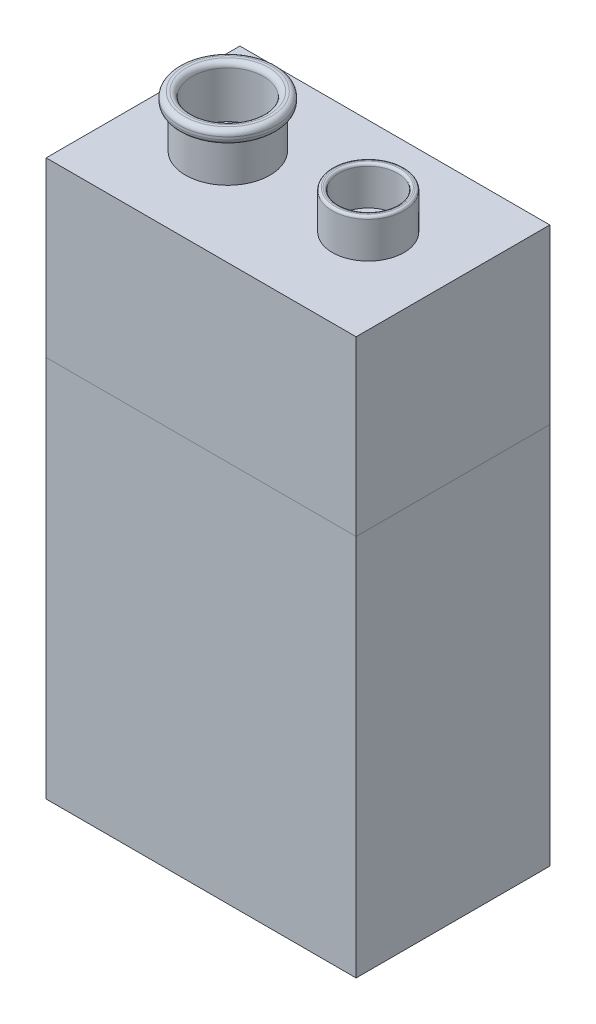
ISO-10303-21;
HEADER;
FILE_DESCRIPTION(('STEP AP214'),'2;1');
FILE_NAME('part.step','',(''),(''),'','','');
FILE_SCHEMA(('AUTOMOTIVE_DESIGN { 1 0 10303 214 1 1 1 1 }'));
ENDSEC;
DATA;
#1=APPLICATION_CONTEXT('core data for automotive mechanical design processes');
#2=APPLICATION_PROTOCOL_DEFINITION('international standard','automotive_design',2000,#1);
#3=PRODUCT_CONTEXT('',#1,'mechanical');
#4=PRODUCT('Part','Part','',(#3));
#5=PRODUCT_RELATED_PRODUCT_CATEGORY('part','',(#4));
#6=PRODUCT_DEFINITION_FORMATION('','',#4);
#7=PRODUCT_DEFINITION_CONTEXT('part definition',#1,'design');
#8=PRODUCT_DEFINITION('design','',#6,#7);
#9=PRODUCT_DEFINITION_SHAPE('','',#8);
#10=(LENGTH_UNIT() NAMED_UNIT(*) SI_UNIT(.MILLI.,.METRE.));
#11=(NAMED_UNIT(*) PLANE_ANGLE_UNIT() SI_UNIT($,.RADIAN.));
#12=(NAMED_UNIT(*) SI_UNIT($,.STERADIAN.) SOLID_ANGLE_UNIT());
#13=UNCERTAINTY_MEASURE_WITH_UNIT(LENGTH_MEASURE(1.E-05),#10,'distance_accuracy_value','');
#14=(GEOMETRIC_REPRESENTATION_CONTEXT(3) GLOBAL_UNCERTAINTY_ASSIGNED_CONTEXT((#13)) GLOBAL_UNIT_ASSIGNED_CONTEXT((#10,
#11,#12)) REPRESENTATION_CONTEXT('',''));
#15=CARTESIAN_POINT('',(0.,0.,0.));
#16=DIRECTION('',(0.,0.,1.));
#17=DIRECTION('',(1.,0.,0.));
#18=AXIS2_PLACEMENT_3D('',#15,#16,#17);
#19=CARTESIAN_POINT('',(0.,43.,0.));
#20=DIRECTION('',(1.,0.,0.));
#21=DIRECTION('',(0.,0.,-1.));
#22=AXIS2_PLACEMENT_3D('',#19,#20,#21);
#23=PLANE('',#22);
#24=DIRECTION('',(0.,0.,1.));
#25=VECTOR('',#24,1.);
#26=CARTESIAN_POINT('',(0.,29.6107821595239,0.));
#27=LINE('',#26,#25);
#28=CARTESIAN_POINT('',(0.,29.6107821595239,-15.));
#29=VERTEX_POINT('',#28);
#30=CARTESIAN_POINT('',(0.,29.6107821595239,0.));
#31=VERTEX_POINT('',#30);
#32=EDGE_CURVE('E11',#29,#31,#27,.T.);
#33=ORIENTED_EDGE('',*,*,#32,.F.);
#34=DIRECTION('',(0.,-1.,0.));
#35=VECTOR('',#34,1.);
#36=CARTESIAN_POINT('',(0.,43.,-15.));
#37=LINE('',#36,#35);
#38=CARTESIAN_POINT('',(0.,0.,-15.));
#39=VERTEX_POINT('',#38);
#40=EDGE_CURVE('E180',#29,#39,#37,.T.);
#41=ORIENTED_EDGE('',*,*,#40,.T.);
#42=DIRECTION('',(0.,0.,1.));
#43=VECTOR('',#42,1.);
#44=CARTESIAN_POINT('',(0.,0.,0.));
#45=LINE('',#44,#43);
#46=CARTESIAN_POINT('',(0.,0.,0.));
#47=VERTEX_POINT('',#46);
#48=EDGE_CURVE('E183',#39,#47,#45,.T.);
#49=ORIENTED_EDGE('',*,*,#48,.T.);
#50=DIRECTION('',(0.,-1.,0.));
#51=VECTOR('',#50,1.);
#52=CARTESIAN_POINT('',(0.,43.,0.));
#53=LINE('',#52,#51);
#54=EDGE_CURVE('E115',#31,#47,#53,.T.);
#55=ORIENTED_EDGE('',*,*,#54,.F.);
#56=EDGE_LOOP('',(#33,#41,#49,#55));
#57=FACE_BOUND('',#56,.T.);
#58=ADVANCED_FACE('F36',(#57),#23,.F.);
#59=CARTESIAN_POINT('',(0.,43.,-15.));
#60=DIRECTION('',(0.,0.,1.));
#61=DIRECTION('',(1.,0.,0.));
#62=AXIS2_PLACEMENT_3D('',#59,#60,#61);
#63=PLANE('',#62);
#64=DIRECTION('',(-1.,0.,0.));
#65=VECTOR('',#64,1.);
#66=CARTESIAN_POINT('',(0.,29.6107821595239,-15.));
#67=LINE('',#66,#65);
#68=CARTESIAN_POINT('',(24.,29.6107821595239,-15.));
#69=VERTEX_POINT('',#68);
#70=EDGE_CURVE('E46',#69,#29,#67,.T.);
#71=ORIENTED_EDGE('',*,*,#70,.F.);
#72=DIRECTION('',(0.,-1.,0.));
#73=VECTOR('',#72,1.);
#74=CARTESIAN_POINT('',(24.,43.,-15.));
#75=LINE('',#74,#73);
#76=CARTESIAN_POINT('',(24.,0.,-15.));
#77=VERTEX_POINT('',#76);
#78=EDGE_CURVE('E193',#69,#77,#75,.T.);
#79=ORIENTED_EDGE('',*,*,#78,.T.);
#80=DIRECTION('',(-1.,0.,0.));
#81=VECTOR('',#80,1.);
#82=CARTESIAN_POINT('',(0.,0.,-15.));
#83=LINE('',#82,#81);
#84=EDGE_CURVE('E110',#77,#39,#83,.T.);
#85=ORIENTED_EDGE('',*,*,#84,.T.);
#86=ORIENTED_EDGE('',*,*,#40,.F.);
#87=EDGE_LOOP('',(#71,#79,#85,#86));
#88=FACE_BOUND('',#87,.T.);
#89=ADVANCED_FACE('F195',(#88),#63,.F.);
#90=CARTESIAN_POINT('',(24.,43.,0.));
#91=DIRECTION('',(-1.,0.,0.));
#92=DIRECTION('',(0.,0.,1.));
#93=AXIS2_PLACEMENT_3D('',#90,#91,#92);
#94=PLANE('',#93);
#95=DIRECTION('',(0.,0.,-1.));
#96=VECTOR('',#95,1.);
#97=CARTESIAN_POINT('',(24.,29.6107821595239,0.));
#98=LINE('',#97,#96);
#99=CARTESIAN_POINT('',(24.,29.6107821595239,0.));
#100=VERTEX_POINT('',#99);
#101=EDGE_CURVE('E156',#100,#69,#98,.T.);
#102=ORIENTED_EDGE('',*,*,#101,.F.);
#103=DIRECTION('',(0.,-1.,0.));
#104=VECTOR('',#103,1.);
#105=CARTESIAN_POINT('',(24.,43.,0.));
#106=LINE('',#105,#104);
#107=CARTESIAN_POINT('',(24.,0.,0.));
#108=VERTEX_POINT('',#107);
#109=EDGE_CURVE('E169',#100,#108,#106,.T.);
#110=ORIENTED_EDGE('',*,*,#109,.T.);
#111=DIRECTION('',(0.,0.,-1.));
#112=VECTOR('',#111,1.);
#113=CARTESIAN_POINT('',(24.,0.,0.));
#114=LINE('',#113,#112);
#115=EDGE_CURVE('E188',#108,#77,#114,.T.);
#116=ORIENTED_EDGE('',*,*,#115,.T.);
#117=ORIENTED_EDGE('',*,*,#78,.F.);
#118=EDGE_LOOP('',(#102,#110,#116,#117));
#119=FACE_BOUND('',#118,.T.);
#120=ADVANCED_FACE('F198',(#119),#94,.F.);
#121=CARTESIAN_POINT('',(0.,43.,0.));
#122=DIRECTION('',(0.,0.,-1.));
#123=DIRECTION('',(-1.,0.,0.));
#124=AXIS2_PLACEMENT_3D('',#121,#122,#123);
#125=PLANE('',#124);
#126=DIRECTION('',(1.,0.,0.));
#127=VECTOR('',#126,1.);
#128=CARTESIAN_POINT('',(0.,29.6107821595239,0.));
#129=LINE('',#128,#127);
#130=EDGE_CURVE('E40',#31,#100,#129,.T.);
#131=ORIENTED_EDGE('',*,*,#130,.F.);
#132=ORIENTED_EDGE('',*,*,#54,.T.);
#133=DIRECTION('',(1.,0.,0.));
#134=VECTOR('',#133,1.);
#135=CARTESIAN_POINT('',(0.,0.,0.));
#136=LINE('',#135,#134);
#137=EDGE_CURVE('E172',#47,#108,#136,.T.);
#138=ORIENTED_EDGE('',*,*,#137,.T.);
#139=ORIENTED_EDGE('',*,*,#109,.F.);
#140=EDGE_LOOP('',(#131,#132,#138,#139));
#141=FACE_BOUND('',#140,.T.);
#142=ADVANCED_FACE('F170',(#141),#125,.F.);
#143=CARTESIAN_POINT('',(0.,43.,0.));
#144=DIRECTION('',(0.,-1.,0.));
#145=DIRECTION('',(0.,0.,-1.));
#146=AXIS2_PLACEMENT_3D('',#143,#144,#145);
#147=PLANE('',#146);
#148=DIRECTION('',(0.,0.,1.));
#149=VECTOR('',#148,1.);
#150=CARTESIAN_POINT('',(0.,43.,0.));
#151=LINE('',#150,#149);
#152=CARTESIAN_POINT('',(0.,43.,-15.));
#153=VERTEX_POINT('',#152);
#154=CARTESIAN_POINT('',(0.,43.,0.));
#155=VERTEX_POINT('',#154);
#156=EDGE_CURVE('E100',#153,#155,#151,.T.);
#157=ORIENTED_EDGE('',*,*,#156,.T.);
#158=DIRECTION('',(1.,0.,0.));
#159=VECTOR('',#158,1.);
#160=CARTESIAN_POINT('',(0.,43.,0.));
#161=LINE('',#160,#159);
#162=CARTESIAN_POINT('',(24.,43.,0.));
#163=VERTEX_POINT('',#162);
#164=EDGE_CURVE('E89',#155,#163,#161,.T.);
#165=ORIENTED_EDGE('',*,*,#164,.T.);
#166=DIRECTION('',(0.,0.,-1.));
#167=VECTOR('',#166,1.);
#168=CARTESIAN_POINT('',(24.,43.,0.));
#169=LINE('',#168,#167);
#170=CARTESIAN_POINT('',(24.,43.,-15.));
#171=VERTEX_POINT('',#170);
#172=EDGE_CURVE('E99',#163,#171,#169,.T.);
#173=ORIENTED_EDGE('',*,*,#172,.T.);
#174=DIRECTION('',(-1.,0.,0.));
#175=VECTOR('',#174,1.);
#176=CARTESIAN_POINT('',(0.,43.,-15.));
#177=LINE('',#176,#175);
#178=EDGE_CURVE('E106',#171,#153,#177,.T.);
#179=ORIENTED_EDGE('',*,*,#178,.T.);
#180=EDGE_LOOP('',(#157,#165,#173,#179));
#181=FACE_BOUND('',#180,.T.);
#182=CARTESIAN_POINT('',(17.4384015816331,43.,-7.5));
#183=DIRECTION('',(0.,-1.,0.));
#184=DIRECTION('',(0.,0.,-1.));
#185=AXIS2_PLACEMENT_3D('',#182,#183,#184);
#186=CIRCLE('',#185,2.77168715053474);
#187=CARTESIAN_POINT('',(17.4384015816331,43.,-10.2716871505347));
#188=VERTEX_POINT('',#187);
#189=EDGE_CURVE('E114',#188,#188,#186,.F.);
#190=ORIENTED_EDGE('',*,*,#189,.F.);
#191=EDGE_LOOP('',(#190));
#192=FACE_BOUND('',#191,.T.);
#193=CARTESIAN_POINT('',(6.56159841836691,43.,-7.5));
#194=DIRECTION('',(0.,-1.,0.));
#195=DIRECTION('',(0.,0.,-1.));
#196=AXIS2_PLACEMENT_3D('',#193,#194,#195);
#197=CIRCLE('',#196,3.27168715053474);
#198=CARTESIAN_POINT('',(6.56159841836691,43.,-10.7716871505347));
#199=VERTEX_POINT('',#198);
#200=EDGE_CURVE('E118',#199,#199,#197,.F.);
#201=ORIENTED_EDGE('',*,*,#200,.F.);
#202=EDGE_LOOP('',(#201));
#203=FACE_BOUND('',#202,.T.);
#204=ADVANCED_FACE('F103',(#181,#192,#203),#147,.F.);
#205=EDGE_CURVE('E192',#153,#29,#37,.T.);
#206=ORIENTED_EDGE('',*,*,#205,.T.);
#207=ORIENTED_EDGE('',*,*,#32,.T.);
#208=EDGE_CURVE('E94',#155,#31,#53,.T.);
#209=ORIENTED_EDGE('',*,*,#208,.F.);
#210=ORIENTED_EDGE('',*,*,#156,.F.);
#211=EDGE_LOOP('',(#206,#207,#209,#210));
#212=FACE_BOUND('',#211,.T.);
#213=ADVANCED_FACE('F112',(#212),#23,.F.);
#214=ORIENTED_EDGE('',*,*,#208,.T.);
#215=ORIENTED_EDGE('',*,*,#130,.T.);
#216=EDGE_CURVE('E96',#163,#100,#106,.T.);
#217=ORIENTED_EDGE('',*,*,#216,.F.);
#218=ORIENTED_EDGE('',*,*,#164,.F.);
#219=EDGE_LOOP('',(#214,#215,#217,#218));
#220=FACE_BOUND('',#219,.T.);
#221=ADVANCED_FACE('F91',(#220),#125,.F.);
#222=ORIENTED_EDGE('',*,*,#216,.T.);
#223=ORIENTED_EDGE('',*,*,#101,.T.);
#224=EDGE_CURVE('E176',#171,#69,#75,.T.);
#225=ORIENTED_EDGE('',*,*,#224,.F.);
#226=ORIENTED_EDGE('',*,*,#172,.F.);
#227=EDGE_LOOP('',(#222,#223,#225,#226));
#228=FACE_BOUND('',#227,.T.);
#229=ADVANCED_FACE('F177',(#228),#94,.F.);
#230=ORIENTED_EDGE('',*,*,#224,.T.);
#231=ORIENTED_EDGE('',*,*,#70,.T.);
#232=ORIENTED_EDGE('',*,*,#205,.F.);
#233=ORIENTED_EDGE('',*,*,#178,.F.);
#234=EDGE_LOOP('',(#230,#231,#232,#233));
#235=FACE_BOUND('',#234,.T.);
#236=ADVANCED_FACE('F201',(#235),#63,.F.);
#237=CARTESIAN_POINT('',(0.,0.,0.));
#238=DIRECTION('',(0.,-1.,0.));
#239=DIRECTION('',(0.,0.,-1.));
#240=AXIS2_PLACEMENT_3D('',#237,#238,#239);
#241=PLANE('',#240);
#242=ORIENTED_EDGE('',*,*,#48,.F.);
#243=ORIENTED_EDGE('',*,*,#84,.F.);
#244=ORIENTED_EDGE('',*,*,#115,.F.);
#245=ORIENTED_EDGE('',*,*,#137,.F.);
#246=EDGE_LOOP('',(#242,#243,#244,#245));
#247=FACE_BOUND('',#246,.T.);
#248=ADVANCED_FACE('F200',(#247),#241,.T.);
#249=CARTESIAN_POINT('',(17.4384015816331,46.,-7.5));
#250=DIRECTION('',(0.,-1.,0.));
#251=DIRECTION('',(0.,0.,-1.));
#252=AXIS2_PLACEMENT_3D('',#249,#250,#251);
#253=PLANE('',#252);
#254=CARTESIAN_POINT('',(17.4384015816331,46.,-7.5));
#255=DIRECTION('',(0.,-1.,0.));
#256=DIRECTION('',(0.,0.,-1.));
#257=AXIS2_PLACEMENT_3D('',#254,#255,#256);
#258=CIRCLE('',#257,2.57168715053474);
#259=CARTESIAN_POINT('',(17.4384015816331,46.,-10.0716871505347));
#260=VERTEX_POINT('',#259);
#261=EDGE_CURVE('E146',#260,#260,#258,.F.);
#262=ORIENTED_EDGE('',*,*,#261,.T.);
#263=EDGE_LOOP('',(#262));
#264=FACE_BOUND('',#263,.T.);
#265=CARTESIAN_POINT('',(17.4384015816331,46.,-7.5));
#266=DIRECTION('',(0.,-1.,0.));
#267=DIRECTION('',(0.,0.,-1.));
#268=AXIS2_PLACEMENT_3D('',#265,#266,#267);
#269=CIRCLE('',#268,2.47168715053474);
#270=CARTESIAN_POINT('',(17.4384015816331,46.,-9.97168715053474));
#271=VERTEX_POINT('',#270);
#272=EDGE_CURVE('E143',#271,#271,#269,.T.);
#273=ORIENTED_EDGE('',*,*,#272,.T.);
#274=EDGE_LOOP('',(#273));
#275=FACE_BOUND('',#274,.T.);
#276=ADVANCED_FACE('F208',(#264,#275),#253,.F.);
#277=CARTESIAN_POINT('',(17.4384015816331,46.,-7.5));
#278=DIRECTION('',(0.,-1.,0.));
#279=DIRECTION('',(0.,0.,-1.));
#280=AXIS2_PLACEMENT_3D('',#277,#278,#279);
#281=CYLINDRICAL_SURFACE('',#280,2.77168715053474);
#282=CARTESIAN_POINT('',(17.4384015816331,45.8,-7.5));
#283=DIRECTION('',(0.,-1.,0.));
#284=DIRECTION('',(0.,0.,-1.));
#285=AXIS2_PLACEMENT_3D('',#282,#283,#284);
#286=CIRCLE('',#285,2.77168715053474);
#287=CARTESIAN_POINT('',(17.4384015816331,45.8,-10.2716871505347));
#288=VERTEX_POINT('',#287);
#289=EDGE_CURVE('E149',#288,#288,#286,.T.);
#290=ORIENTED_EDGE('',*,*,#289,.T.);
#291=EDGE_LOOP('',(#290));
#292=FACE_BOUND('',#291,.T.);
#293=ORIENTED_EDGE('',*,*,#189,.T.);
#294=EDGE_LOOP('',(#293));
#295=FACE_BOUND('',#294,.T.);
#296=ADVANCED_FACE('F245',(#292,#295),#281,.T.);
#297=CARTESIAN_POINT('',(17.4384015816331,46.,-7.5));
#298=DIRECTION('',(0.,-1.,0.));
#299=DIRECTION('',(0.,0.,-1.));
#300=AXIS2_PLACEMENT_3D('',#297,#298,#299);
#301=CYLINDRICAL_SURFACE('',#300,2.27168715053474);
#302=CARTESIAN_POINT('',(17.4384015816331,45.8,-7.5));
#303=DIRECTION('',(0.,-1.,0.));
#304=DIRECTION('',(0.,0.,-1.));
#305=AXIS2_PLACEMENT_3D('',#302,#303,#304);
#306=CIRCLE('',#305,2.27168715053474);
#307=CARTESIAN_POINT('',(17.4384015816331,45.8,-9.77168715053474));
#308=VERTEX_POINT('',#307);
#309=EDGE_CURVE('E152',#308,#308,#306,.F.);
#310=ORIENTED_EDGE('',*,*,#309,.T.);
#311=EDGE_LOOP('',(#310));
#312=FACE_BOUND('',#311,.T.);
#313=CARTESIAN_POINT('',(17.4384015816331,43.,-7.5));
#314=DIRECTION('',(0.,1.,0.));
#315=DIRECTION('',(0.,0.,-1.));
#316=AXIS2_PLACEMENT_3D('',#313,#314,#315);
#317=CIRCLE('',#316,2.27168715053474);
#318=CARTESIAN_POINT('',(17.4384015816331,43.,-9.77168715053474));
#319=VERTEX_POINT('',#318);
#320=EDGE_CURVE('E186',#319,#319,#317,.T.);
#321=ORIENTED_EDGE('',*,*,#320,.F.);
#322=EDGE_LOOP('',(#321));
#323=FACE_BOUND('',#322,.T.);
#324=ADVANCED_FACE('F236',(#312,#323),#301,.F.);
#325=ORIENTED_EDGE('',*,*,#320,.T.);
#326=EDGE_LOOP('',(#325));
#327=FACE_BOUND('',#326,.T.);
#328=ADVANCED_FACE('F225',(#327),#147,.F.);
#329=CARTESIAN_POINT('',(6.56159841836691,46.,-7.5));
#330=DIRECTION('',(0.,-1.,0.));
#331=DIRECTION('',(0.,0.,-1.));
#332=AXIS2_PLACEMENT_3D('',#329,#330,#331);
#333=CYLINDRICAL_SURFACE('',#332,3.27168715053474);
#334=CARTESIAN_POINT('',(6.56159841836691,46.,-7.5));
#335=DIRECTION('',(0.,1.,0.));
#336=DIRECTION('',(0.,0.,1.));
#337=AXIS2_PLACEMENT_3D('',#334,#335,#336);
#338=CIRCLE('',#337,3.27168715053474);
#339=CARTESIAN_POINT('',(6.56159841836691,46.,-4.22831284946526));
#340=VERTEX_POINT('',#339);
#341=EDGE_CURVE('E251',#340,#340,#338,.T.);
#342=ORIENTED_EDGE('',*,*,#341,.F.);
#343=EDGE_LOOP('',(#342));
#344=FACE_BOUND('',#343,.T.);
#345=ORIENTED_EDGE('',*,*,#200,.T.);
#346=EDGE_LOOP('',(#345));
#347=FACE_BOUND('',#346,.T.);
#348=ADVANCED_FACE('F235',(#344,#347),#333,.T.);
#349=CARTESIAN_POINT('',(6.56159841836691,46.,-7.5));
#350=DIRECTION('',(0.,1.,0.));
#351=DIRECTION('',(0.,0.,1.));
#352=AXIS2_PLACEMENT_3D('',#349,#350,#351);
#353=PLANE('',#352);
#354=CARTESIAN_POINT('',(6.56159841836691,46.,-7.5));
#355=DIRECTION('',(0.,1.,0.));
#356=DIRECTION('',(0.,0.,1.));
#357=AXIS2_PLACEMENT_3D('',#354,#355,#356);
#358=CIRCLE('',#357,3.37168715053474);
#359=CARTESIAN_POINT('',(6.56159841836691,46.,-4.12831284946526));
#360=VERTEX_POINT('',#359);
#361=EDGE_CURVE('E131',#360,#360,#358,.F.);
#362=ORIENTED_EDGE('',*,*,#361,.T.);
#363=EDGE_LOOP('',(#362));
#364=FACE_BOUND('',#363,.T.);
#365=ORIENTED_EDGE('',*,*,#341,.T.);
#366=EDGE_LOOP('',(#365));
#367=FACE_BOUND('',#366,.T.);
#368=ADVANCED_FACE('F242',(#364,#367),#353,.F.);
#369=CARTESIAN_POINT('',(6.56159841836691,47.,-7.5));
#370=DIRECTION('',(0.,1.,0.));
#371=DIRECTION('',(0.,0.,1.));
#372=AXIS2_PLACEMENT_3D('',#369,#370,#371);
#373=PLANE('',#372);
#374=CARTESIAN_POINT('',(6.56159841836691,47.,-7.5));
#375=DIRECTION('',(0.,1.,0.));
#376=DIRECTION('',(0.,0.,1.));
#377=AXIS2_PLACEMENT_3D('',#374,#375,#376);
#378=CIRCLE('',#377,3.37168715053474);
#379=CARTESIAN_POINT('',(6.56159841836691,47.,-4.12831284946526));
#380=VERTEX_POINT('',#379);
#381=EDGE_CURVE('E137',#380,#380,#378,.T.);
#382=ORIENTED_EDGE('',*,*,#381,.T.);
#383=EDGE_LOOP('',(#382));
#384=FACE_BOUND('',#383,.T.);
#385=CARTESIAN_POINT('',(6.56159841836691,47.,-7.5));
#386=DIRECTION('',(0.,1.,0.));
#387=DIRECTION('',(0.,0.,1.));
#388=AXIS2_PLACEMENT_3D('',#385,#386,#387);
#389=CIRCLE('',#388,3.17168715053474);
#390=CARTESIAN_POINT('',(6.56159841836691,47.,-4.32831284946526));
#391=VERTEX_POINT('',#390);
#392=EDGE_CURVE('E134',#391,#391,#389,.F.);
#393=ORIENTED_EDGE('',*,*,#392,.T.);
#394=EDGE_LOOP('',(#393));
#395=FACE_BOUND('',#394,.T.);
#396=ADVANCED_FACE('F337',(#384,#395),#373,.T.);
#397=CARTESIAN_POINT('',(6.56159841836691,47.,-7.5));
#398=DIRECTION('',(0.,-1.,0.));
#399=DIRECTION('',(0.,0.,-1.));
#400=AXIS2_PLACEMENT_3D('',#397,#398,#399);
#401=CYLINDRICAL_SURFACE('',#400,3.77168715053474);
#402=CARTESIAN_POINT('',(6.56159841836691,46.4,-7.5));
#403=DIRECTION('',(0.,1.,0.));
#404=DIRECTION('',(0.,0.,1.));
#405=AXIS2_PLACEMENT_3D('',#402,#403,#404);
#406=CIRCLE('',#405,3.77168715053474);
#407=CARTESIAN_POINT('',(6.56159841836691,46.4,-3.72831284946526));
#408=VERTEX_POINT('',#407);
#409=EDGE_CURVE('E128',#408,#408,#406,.T.);
#410=ORIENTED_EDGE('',*,*,#409,.T.);
#411=EDGE_LOOP('',(#410));
#412=FACE_BOUND('',#411,.T.);
#413=CARTESIAN_POINT('',(6.56159841836691,46.6,-7.5));
#414=DIRECTION('',(0.,1.,0.));
#415=DIRECTION('',(0.,0.,1.));
#416=AXIS2_PLACEMENT_3D('',#413,#414,#415);
#417=CIRCLE('',#416,3.77168715053474);
#418=CARTESIAN_POINT('',(6.56159841836691,46.6,-3.72831284946526));
#419=VERTEX_POINT('',#418);
#420=EDGE_CURVE('E125',#419,#419,#417,.F.);
#421=ORIENTED_EDGE('',*,*,#420,.T.);
#422=EDGE_LOOP('',(#421));
#423=FACE_BOUND('',#422,.T.);
#424=ADVANCED_FACE('F232',(#412,#423),#401,.T.);
#425=CARTESIAN_POINT('',(6.56159841836691,43.,-7.5));
#426=DIRECTION('',(0.,1.,0.));
#427=DIRECTION('',(0.,0.,1.));
#428=AXIS2_PLACEMENT_3D('',#425,#426,#427);
#429=CIRCLE('',#428,2.77168715053474);
#430=CARTESIAN_POINT('',(6.56159841836691,43.,-4.72831284946526));
#431=VERTEX_POINT('',#430);
#432=EDGE_CURVE('E254',#431,#431,#429,.T.);
#433=ORIENTED_EDGE('',*,*,#432,.T.);
#434=EDGE_LOOP('',(#433));
#435=FACE_BOUND('',#434,.T.);
#436=ADVANCED_FACE('F224',(#435),#147,.F.);
#437=CARTESIAN_POINT('',(6.56159841836691,46.,-7.5));
#438=DIRECTION('',(0.,-1.,0.));
#439=DIRECTION('',(0.,0.,-1.));
#440=AXIS2_PLACEMENT_3D('',#437,#438,#439);
#441=CYLINDRICAL_SURFACE('',#440,2.77168715053474);
#442=CARTESIAN_POINT('',(6.56159841836691,46.6,-7.5));
#443=DIRECTION('',(0.,1.,0.));
#444=DIRECTION('',(0.,0.,1.));
#445=AXIS2_PLACEMENT_3D('',#442,#443,#444);
#446=CIRCLE('',#445,2.77168715053474);
#447=CARTESIAN_POINT('',(6.56159841836691,46.6,-4.72831284946526));
#448=VERTEX_POINT('',#447);
#449=EDGE_CURVE('E140',#448,#448,#446,.T.);
#450=ORIENTED_EDGE('',*,*,#449,.T.);
#451=EDGE_LOOP('',(#450));
#452=FACE_BOUND('',#451,.T.);
#453=ORIENTED_EDGE('',*,*,#432,.F.);
#454=EDGE_LOOP('',(#453));
#455=FACE_BOUND('',#454,.T.);
#456=ADVANCED_FACE('F231',(#452,#455),#441,.F.);
#457=CARTESIAN_POINT('',(6.56159841836691,46.4,-7.5));
#458=DIRECTION('',(0.,1.,0.));
#459=DIRECTION('',(0.,0.,1.));
#460=AXIS2_PLACEMENT_3D('',#457,#458,#459);
#461=TOROIDAL_SURFACE('',#460,3.37168715053474,0.4);
#462=ORIENTED_EDGE('',*,*,#361,.F.);
#463=EDGE_LOOP('',(#462));
#464=FACE_BOUND('',#463,.T.);
#465=ORIENTED_EDGE('',*,*,#409,.F.);
#466=EDGE_LOOP('',(#465));
#467=FACE_BOUND('',#466,.T.);
#468=ADVANCED_FACE('F261',(#464,#467),#461,.T.);
#469=CARTESIAN_POINT('',(6.56159841836691,46.6,-7.5));
#470=DIRECTION('',(0.,1.,0.));
#471=DIRECTION('',(0.,0.,1.));
#472=AXIS2_PLACEMENT_3D('',#469,#470,#471);
#473=TOROIDAL_SURFACE('',#472,3.37168715053474,0.4);
#474=ORIENTED_EDGE('',*,*,#420,.F.);
#475=EDGE_LOOP('',(#474));
#476=FACE_BOUND('',#475,.T.);
#477=ORIENTED_EDGE('',*,*,#381,.F.);
#478=EDGE_LOOP('',(#477));
#479=FACE_BOUND('',#478,.T.);
#480=ADVANCED_FACE('F267',(#476,#479),#473,.T.);
#481=CARTESIAN_POINT('',(6.56159841836691,46.6,-7.5));
#482=DIRECTION('',(0.,1.,0.));
#483=DIRECTION('',(0.,0.,1.));
#484=AXIS2_PLACEMENT_3D('',#481,#482,#483);
#485=TOROIDAL_SURFACE('',#484,3.17168715053474,0.4);
#486=ORIENTED_EDGE('',*,*,#392,.F.);
#487=EDGE_LOOP('',(#486));
#488=FACE_BOUND('',#487,.T.);
#489=ORIENTED_EDGE('',*,*,#449,.F.);
#490=EDGE_LOOP('',(#489));
#491=FACE_BOUND('',#490,.T.);
#492=ADVANCED_FACE('F288',(#488,#491),#485,.T.);
#493=CARTESIAN_POINT('',(17.4384015816331,45.8,-7.5));
#494=DIRECTION('',(0.,-1.,0.));
#495=DIRECTION('',(0.,0.,-1.));
#496=AXIS2_PLACEMENT_3D('',#493,#494,#495);
#497=TOROIDAL_SURFACE('',#496,2.57168715053474,0.2);
#498=ORIENTED_EDGE('',*,*,#289,.F.);
#499=EDGE_LOOP('',(#498));
#500=FACE_BOUND('',#499,.T.);
#501=ORIENTED_EDGE('',*,*,#261,.F.);
#502=EDGE_LOOP('',(#501));
#503=FACE_BOUND('',#502,.T.);
#504=ADVANCED_FACE('F285',(#500,#503),#497,.T.);
#505=CARTESIAN_POINT('',(17.4384015816331,45.8,-7.5));
#506=DIRECTION('',(0.,-1.,0.));
#507=DIRECTION('',(0.,0.,-1.));
#508=AXIS2_PLACEMENT_3D('',#505,#506,#507);
#509=TOROIDAL_SURFACE('',#508,2.47168715053474,0.2);
#510=ORIENTED_EDGE('',*,*,#272,.F.);
#511=EDGE_LOOP('',(#510));
#512=FACE_BOUND('',#511,.T.);
#513=ORIENTED_EDGE('',*,*,#309,.F.);
#514=EDGE_LOOP('',(#513));
#515=FACE_BOUND('',#514,.T.);
#516=ADVANCED_FACE('F38',(#512,#515),#509,.T.);
#517=CLOSED_SHELL('',(#58,#89,#120,#142,#204,#213,#221,#229,#236,#248,#276,#296,#324,#328,#348,
#368,#396,#424,#436,#456,#468,#480,#492,#504,#516));
#518=MANIFOLD_SOLID_BREP('B2',#517);
#519=ADVANCED_BREP_SHAPE_REPRESENTATION('',(#18,#518),#14);
#520=SHAPE_DEFINITION_REPRESENTATION(#9,#519);
ENDSEC;
END-ISO-10303-21;
